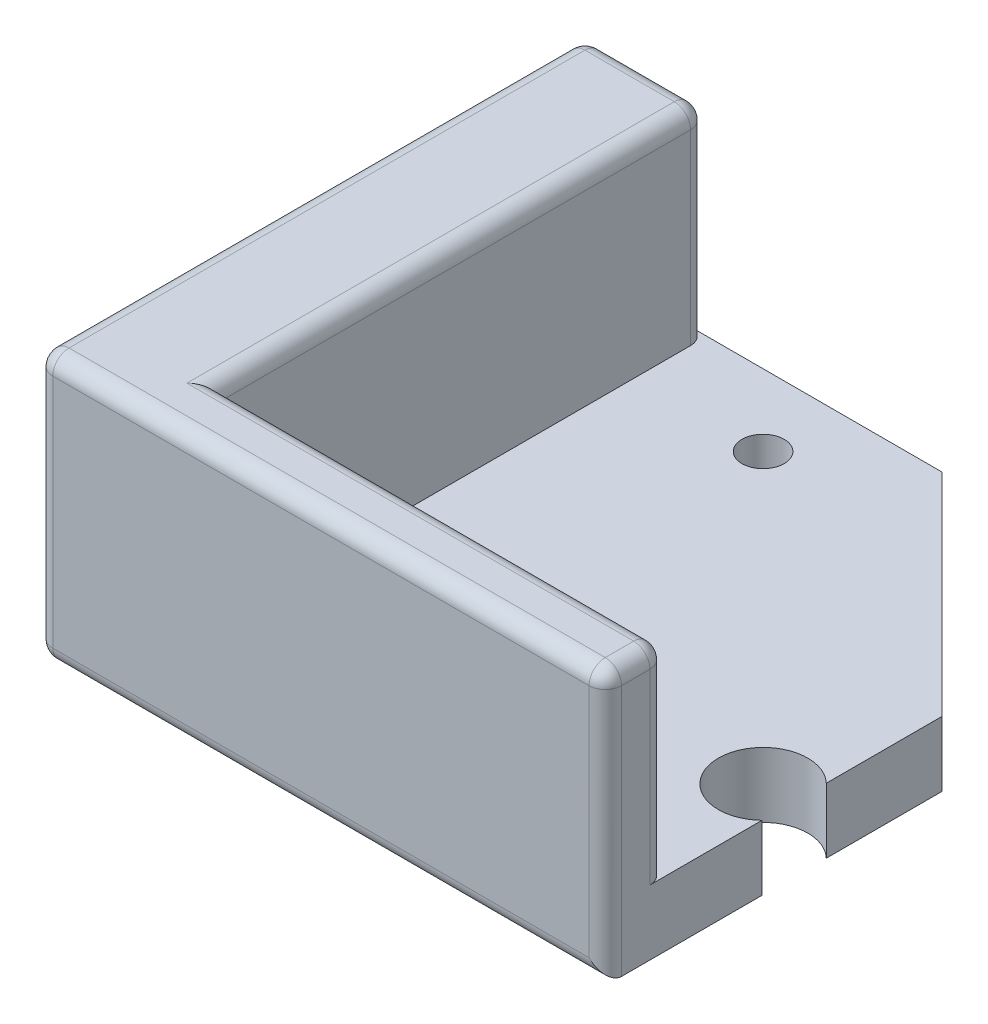
ISO-10303-21;
HEADER;
FILE_DESCRIPTION(('STEP AP214'),'2;1');
FILE_NAME('part.step','',(''),(''),'','','');
FILE_SCHEMA(('AUTOMOTIVE_DESIGN { 1 0 10303 214 1 1 1 1 }'));
ENDSEC;
DATA;
#1=APPLICATION_CONTEXT('core data for automotive mechanical design processes');
#2=APPLICATION_PROTOCOL_DEFINITION('international standard','automotive_design',2000,#1);
#3=PRODUCT_CONTEXT('',#1,'mechanical');
#4=PRODUCT('Part','Part','',(#3));
#5=PRODUCT_RELATED_PRODUCT_CATEGORY('part','',(#4));
#6=PRODUCT_DEFINITION_FORMATION('','',#4);
#7=PRODUCT_DEFINITION_CONTEXT('part definition',#1,'design');
#8=PRODUCT_DEFINITION('design','',#6,#7);
#9=PRODUCT_DEFINITION_SHAPE('','',#8);
#10=(LENGTH_UNIT() NAMED_UNIT(*) SI_UNIT(.MILLI.,.METRE.));
#11=(NAMED_UNIT(*) PLANE_ANGLE_UNIT() SI_UNIT($,.RADIAN.));
#12=(NAMED_UNIT(*) SI_UNIT($,.STERADIAN.) SOLID_ANGLE_UNIT());
#13=UNCERTAINTY_MEASURE_WITH_UNIT(LENGTH_MEASURE(1.E-05),#10,'distance_accuracy_value','');
#14=(GEOMETRIC_REPRESENTATION_CONTEXT(3) GLOBAL_UNCERTAINTY_ASSIGNED_CONTEXT((#13)) GLOBAL_UNIT_ASSIGNED_CONTEXT((#10,
#11,#12)) REPRESENTATION_CONTEXT('',''));
#15=CARTESIAN_POINT('',(0.,0.,0.));
#16=DIRECTION('',(0.,0.,1.));
#17=DIRECTION('',(1.,0.,0.));
#18=AXIS2_PLACEMENT_3D('',#15,#16,#17);
#19=CARTESIAN_POINT('',(0.,2.54,0.));
#20=DIRECTION('',(0.,1.,0.));
#21=DIRECTION('',(0.,0.,1.));
#22=AXIS2_PLACEMENT_3D('',#19,#20,#21);
#23=PLANE('',#22);
#24=DIRECTION('',(-1.,0.,0.));
#25=VECTOR('',#24,1.);
#26=CARTESIAN_POINT('',(34.925,2.54,3.4925));
#27=LINE('',#26,#25);
#28=CARTESIAN_POINT('',(-8.255,2.54,3.49250000000001));
#29=VERTEX_POINT('',#28);
#30=CARTESIAN_POINT('',(33.655,2.54,3.4925));
#31=VERTEX_POINT('',#30);
#32=EDGE_CURVE('E244',#29,#31,#27,.F.);
#33=ORIENTED_EDGE('',*,*,#32,.T.);
#34=DIRECTION('',(0.,0.,-1.));
#35=VECTOR('',#34,1.);
#36=CARTESIAN_POINT('',(33.655,2.54,0.));
#37=LINE('',#36,#35);
#38=CARTESIAN_POINT('',(33.655,2.54,1.27));
#39=VERTEX_POINT('',#38);
#40=EDGE_CURVE('E247',#31,#39,#37,.T.);
#41=ORIENTED_EDGE('',*,*,#40,.T.);
#42=DIRECTION('',(1.,0.,0.));
#43=VECTOR('',#42,1.);
#44=CARTESIAN_POINT('',(0.,2.54,1.27));
#45=LINE('',#44,#43);
#46=CARTESIAN_POINT('',(-1.27,2.54,1.27));
#47=VERTEX_POINT('',#46);
#48=EDGE_CURVE('E343',#39,#47,#45,.F.);
#49=ORIENTED_EDGE('',*,*,#48,.T.);
#50=DIRECTION('',(0.,0.,1.));
#51=VECTOR('',#50,1.);
#52=CARTESIAN_POINT('',(-1.27,2.54,-38.1));
#53=LINE('',#52,#51);
#54=CARTESIAN_POINT('',(-1.27,2.54,-36.83));
#55=VERTEX_POINT('',#54);
#56=EDGE_CURVE('E352',#47,#55,#53,.F.);
#57=ORIENTED_EDGE('',*,*,#56,.T.);
#58=DIRECTION('',(-1.,0.,0.));
#59=VECTOR('',#58,1.);
#60=CARTESIAN_POINT('',(-9.525,2.54,-36.83));
#61=LINE('',#60,#59);
#62=CARTESIAN_POINT('',(-8.255,2.54,-36.83));
#63=VERTEX_POINT('',#62);
#64=EDGE_CURVE('E336',#55,#63,#61,.T.);
#65=ORIENTED_EDGE('',*,*,#64,.T.);
#66=DIRECTION('',(0.,0.,1.));
#67=VECTOR('',#66,1.);
#68=CARTESIAN_POINT('',(-8.255,2.54,0.));
#69=LINE('',#68,#67);
#70=EDGE_CURVE('E332',#63,#29,#69,.T.);
#71=ORIENTED_EDGE('',*,*,#70,.T.);
#72=EDGE_LOOP('',(#33,#41,#49,#57,#65,#71));
#73=FACE_BOUND('',#72,.T.);
#74=ADVANCED_FACE('F47',(#73),#23,.T.);
#75=CARTESIAN_POINT('',(0.,-13.335,0.));
#76=DIRECTION('',(0.,0.,-1.));
#77=DIRECTION('',(-1.,0.,0.));
#78=AXIS2_PLACEMENT_3D('',#75,#76,#77);
#79=PLANE('',#78);
#80=DIRECTION('',(1.,0.,0.));
#81=VECTOR('',#80,1.);
#82=CARTESIAN_POINT('',(0.,1.27,0.));
#83=LINE('',#82,#81);
#84=CARTESIAN_POINT('',(0.,1.27,0.));
#85=VERTEX_POINT('',#84);
#86=CARTESIAN_POINT('',(33.655,1.27,0.));
#87=VERTEX_POINT('',#86);
#88=EDGE_CURVE('E371',#85,#87,#83,.T.);
#89=ORIENTED_EDGE('',*,*,#88,.T.);
#90=DIRECTION('',(0.,-1.,0.));
#91=VECTOR('',#90,1.);
#92=CARTESIAN_POINT('',(33.655,-13.335,0.));
#93=LINE('',#92,#91);
#94=CARTESIAN_POINT('',(33.655,-13.335,0.));
#95=VERTEX_POINT('',#94);
#96=EDGE_CURVE('E189',#87,#95,#93,.T.);
#97=ORIENTED_EDGE('',*,*,#96,.T.);
#98=DIRECTION('',(-1.,0.,0.));
#99=VECTOR('',#98,1.);
#100=CARTESIAN_POINT('',(0.,-13.335,0.));
#101=LINE('',#100,#99);
#102=CARTESIAN_POINT('',(0.,-13.335,0.));
#103=VERTEX_POINT('',#102);
#104=EDGE_CURVE('E446',#95,#103,#101,.T.);
#105=ORIENTED_EDGE('',*,*,#104,.T.);
#106=DIRECTION('',(0.,1.,0.));
#107=VECTOR('',#106,1.);
#108=CARTESIAN_POINT('',(0.,-13.335,0.));
#109=LINE('',#108,#107);
#110=EDGE_CURVE('E339',#103,#85,#109,.T.);
#111=ORIENTED_EDGE('',*,*,#110,.T.);
#112=EDGE_LOOP('',(#89,#97,#105,#111));
#113=FACE_BOUND('',#112,.T.);
#114=ADVANCED_FACE('F462',(#113),#79,.T.);
#115=CARTESIAN_POINT('',(0.,-13.335,0.));
#116=DIRECTION('',(0.,-1.,0.));
#117=DIRECTION('',(0.,0.,-1.));
#118=AXIS2_PLACEMENT_3D('',#115,#116,#117);
#119=PLANE('',#118);
#120=CARTESIAN_POINT('',(10.,-13.335,-32.5));
#121=DIRECTION('',(0.,-1.,0.));
#122=DIRECTION('',(0.,0.,-1.));
#123=AXIS2_PLACEMENT_3D('',#120,#121,#122);
#124=CIRCLE('',#123,1.65);
#125=CARTESIAN_POINT('',(10.,-13.335,-34.15));
#126=VERTEX_POINT('',#125);
#127=EDGE_CURVE('E421',#126,#126,#124,.T.);
#128=ORIENTED_EDGE('',*,*,#127,.T.);
#129=EDGE_LOOP('',(#128));
#130=FACE_BOUND('',#129,.T.);
#131=DIRECTION('',(0.,0.,1.));
#132=VECTOR('',#131,1.);
#133=CARTESIAN_POINT('',(34.925,-13.335,0.));
#134=LINE('',#133,#132);
#135=CARTESIAN_POINT('',(34.925,-13.335,-21.5480790919814));
#136=VERTEX_POINT('',#135);
#137=CARTESIAN_POINT('',(34.925,-13.335,-12.5133506022837));
#138=VERTEX_POINT('',#137);
#139=EDGE_CURVE('E183',#136,#138,#134,.T.);
#140=ORIENTED_EDGE('',*,*,#139,.F.);
#141=DIRECTION('',(0.707106781186549,0.,0.707106781186546));
#142=VECTOR('',#141,1.);
#143=CARTESIAN_POINT('',(38.1,-13.335,-18.3730790919814));
#144=LINE('',#143,#142);
#145=CARTESIAN_POINT('',(18.3730790919813,-13.335,-38.1));
#146=VERTEX_POINT('',#145);
#147=EDGE_CURVE('E434',#146,#136,#144,.T.);
#148=ORIENTED_EDGE('',*,*,#147,.F.);
#149=DIRECTION('',(1.,0.,0.));
#150=VECTOR('',#149,1.);
#151=CARTESIAN_POINT('',(-9.52499999999999,-13.335,-38.1));
#152=LINE('',#151,#150);
#153=CARTESIAN_POINT('',(-1.27,-13.335,-38.1));
#154=VERTEX_POINT('',#153);
#155=EDGE_CURVE('E427',#154,#146,#152,.T.);
#156=ORIENTED_EDGE('',*,*,#155,.F.);
#157=CARTESIAN_POINT('',(-1.27,-13.335,-36.83));
#158=DIRECTION('',(0.,-1.,0.));
#159=DIRECTION('',(0.,0.,-1.));
#160=AXIS2_PLACEMENT_3D('',#157,#158,#159);
#161=CIRCLE('',#160,1.27);
#162=CARTESIAN_POINT('',(0.,-13.335,-36.83));
#163=VERTEX_POINT('',#162);
#164=EDGE_CURVE('E221',#154,#163,#161,.T.);
#165=ORIENTED_EDGE('',*,*,#164,.T.);
#166=DIRECTION('',(0.,0.,1.));
#167=VECTOR('',#166,1.);
#168=CARTESIAN_POINT('',(0.,-13.335,0.));
#169=LINE('',#168,#167);
#170=EDGE_CURVE('E346',#163,#103,#169,.T.);
#171=ORIENTED_EDGE('',*,*,#170,.T.);
#172=ORIENTED_EDGE('',*,*,#104,.F.);
#173=CARTESIAN_POINT('',(33.655,-13.335,1.27));
#174=DIRECTION('',(0.,-1.,0.));
#175=DIRECTION('',(0.,0.,-1.));
#176=AXIS2_PLACEMENT_3D('',#173,#174,#175);
#177=CIRCLE('',#176,1.27);
#178=CARTESIAN_POINT('',(34.925,-13.335,1.27));
#179=VERTEX_POINT('',#178);
#180=EDGE_CURVE('E11',#95,#179,#177,.T.);
#181=ORIENTED_EDGE('',*,*,#180,.T.);
#182=CARTESIAN_POINT('',(34.925,-13.335,-7.48664939771626));
#183=VERTEX_POINT('',#182);
#184=EDGE_CURVE('E480',#183,#179,#134,.T.);
#185=ORIENTED_EDGE('',*,*,#184,.F.);
#186=CARTESIAN_POINT('',(32.5,-13.335,-10.));
#187=DIRECTION('',(0.,1.,0.));
#188=DIRECTION('',(0.,0.,1.));
#189=AXIS2_PLACEMENT_3D('',#186,#187,#188);
#190=CIRCLE('',#189,3.49250000000001);
#191=EDGE_CURVE('E207',#138,#183,#190,.T.);
#192=ORIENTED_EDGE('',*,*,#191,.F.);
#193=EDGE_LOOP('',(#140,#148,#156,#165,#171,#172,#181,#185,#192));
#194=FACE_BOUND('',#193,.T.);
#195=ADVANCED_FACE('F454',(#130,#194),#119,.F.);
#196=CARTESIAN_POINT('',(38.1,-18.415,-18.3730790919814));
#197=DIRECTION('',(-0.707106781186546,0.,0.707106781186549));
#198=DIRECTION('',(0.707106781186549,0.,0.707106781186546));
#199=AXIS2_PLACEMENT_3D('',#196,#197,#198);
#200=PLANE('',#199);
#201=DIRECTION('',(0.,1.,0.));
#202=VECTOR('',#201,1.);
#203=CARTESIAN_POINT('',(34.925,-18.415,-21.5480790919814));
#204=LINE('',#203,#202);
#205=CARTESIAN_POINT('',(34.925,-18.415,-21.5480790919814));
#206=VERTEX_POINT('',#205);
#207=EDGE_CURVE('E214',#206,#136,#204,.T.);
#208=ORIENTED_EDGE('',*,*,#207,.F.);
#209=DIRECTION('',(0.707106781186549,0.,0.707106781186546));
#210=VECTOR('',#209,1.);
#211=CARTESIAN_POINT('',(38.1,-18.415,-18.3730790919814));
#212=LINE('',#211,#210);
#213=CARTESIAN_POINT('',(18.3730790919813,-18.415,-38.1));
#214=VERTEX_POINT('',#213);
#215=EDGE_CURVE('E199',#214,#206,#212,.T.);
#216=ORIENTED_EDGE('',*,*,#215,.F.);
#217=DIRECTION('',(0.,1.,0.));
#218=VECTOR('',#217,1.);
#219=CARTESIAN_POINT('',(18.3730790919813,-18.415,-38.1));
#220=LINE('',#219,#218);
#221=EDGE_CURVE('E437',#214,#146,#220,.T.);
#222=ORIENTED_EDGE('',*,*,#221,.T.);
#223=ORIENTED_EDGE('',*,*,#147,.T.);
#224=EDGE_LOOP('',(#208,#216,#222,#223));
#225=FACE_BOUND('',#224,.T.);
#226=ADVANCED_FACE('F489',(#225),#200,.F.);
#227=CARTESIAN_POINT('',(0.,-18.415,0.));
#228=DIRECTION('',(0.,-1.,0.));
#229=DIRECTION('',(0.,0.,-1.));
#230=AXIS2_PLACEMENT_3D('',#227,#228,#229);
#231=PLANE('',#230);
#232=CARTESIAN_POINT('',(10.,-18.415,-32.5));
#233=DIRECTION('',(0.,-1.,0.));
#234=DIRECTION('',(0.,0.,-1.));
#235=AXIS2_PLACEMENT_3D('',#232,#233,#234);
#236=CIRCLE('',#235,1.65);
#237=CARTESIAN_POINT('',(10.,-18.415,-34.15));
#238=VERTEX_POINT('',#237);
#239=EDGE_CURVE('E414',#238,#238,#236,.T.);
#240=ORIENTED_EDGE('',*,*,#239,.F.);
#241=EDGE_LOOP('',(#240));
#242=FACE_BOUND('',#241,.T.);
#243=DIRECTION('',(0.,0.,-1.));
#244=VECTOR('',#243,1.);
#245=CARTESIAN_POINT('',(34.925,-18.415,0.));
#246=LINE('',#245,#244);
#247=CARTESIAN_POINT('',(34.925,-18.415,3.4925));
#248=VERTEX_POINT('',#247);
#249=CARTESIAN_POINT('',(34.925,-18.415,-7.48664939771626));
#250=VERTEX_POINT('',#249);
#251=EDGE_CURVE('E201',#248,#250,#246,.T.);
#252=ORIENTED_EDGE('',*,*,#251,.F.);
#253=DIRECTION('',(-1.,0.,0.));
#254=VECTOR('',#253,1.);
#255=CARTESIAN_POINT('',(-8.255,-18.415,3.49250000000001));
#256=LINE('',#255,#254);
#257=CARTESIAN_POINT('',(-8.255,-18.415,3.49250000000001));
#258=VERTEX_POINT('',#257);
#259=EDGE_CURVE('E260',#248,#258,#256,.T.);
#260=ORIENTED_EDGE('',*,*,#259,.T.);
#261=DIRECTION('',(0.,0.,-1.));
#262=VECTOR('',#261,1.);
#263=CARTESIAN_POINT('',(-8.255,-18.415,0.));
#264=LINE('',#263,#262);
#265=CARTESIAN_POINT('',(-8.255,-18.415,-38.1));
#266=VERTEX_POINT('',#265);
#267=EDGE_CURVE('E375',#258,#266,#264,.T.);
#268=ORIENTED_EDGE('',*,*,#267,.T.);
#269=DIRECTION('',(1.,0.,0.));
#270=VECTOR('',#269,1.);
#271=CARTESIAN_POINT('',(-9.52499999999999,-18.415,-38.1));
#272=LINE('',#271,#270);
#273=EDGE_CURVE('E431',#266,#214,#272,.T.);
#274=ORIENTED_EDGE('',*,*,#273,.T.);
#275=ORIENTED_EDGE('',*,*,#215,.T.);
#276=CARTESIAN_POINT('',(34.925,-18.415,-12.5133506022837));
#277=VERTEX_POINT('',#276);
#278=EDGE_CURVE('E180',#277,#206,#246,.T.);
#279=ORIENTED_EDGE('',*,*,#278,.F.);
#280=CARTESIAN_POINT('',(32.5,-18.415,-10.));
#281=DIRECTION('',(0.,-1.,0.));
#282=DIRECTION('',(0.,0.,-1.));
#283=AXIS2_PLACEMENT_3D('',#280,#281,#282);
#284=CIRCLE('',#283,3.49250000000001);
#285=EDGE_CURVE('E197',#250,#277,#284,.T.);
#286=ORIENTED_EDGE('',*,*,#285,.F.);
#287=EDGE_LOOP('',(#252,#260,#268,#274,#275,#279,#286));
#288=FACE_BOUND('',#287,.T.);
#289=ADVANCED_FACE('F196',(#242,#288),#231,.T.);
#290=CARTESIAN_POINT('',(0.,1.27,1.27));
#291=DIRECTION('',(1.,0.,0.));
#292=DIRECTION('',(0.,0.,-1.));
#293=AXIS2_PLACEMENT_3D('',#290,#291,#292);
#294=CYLINDRICAL_SURFACE('',#293,1.27);
#295=ORIENTED_EDGE('',*,*,#48,.F.);
#296=CARTESIAN_POINT('',(33.655,1.27,1.27));
#297=DIRECTION('',(1.,0.,0.));
#298=DIRECTION('',(0.,0.,-1.));
#299=AXIS2_PLACEMENT_3D('',#296,#297,#298);
#300=CIRCLE('',#299,1.27);
#301=EDGE_CURVE('E235',#39,#87,#300,.F.);
#302=ORIENTED_EDGE('',*,*,#301,.T.);
#303=ORIENTED_EDGE('',*,*,#88,.F.);
#304=CARTESIAN_POINT('',(-1.27,1.27,1.27));
#305=DIRECTION('',(-0.707106781186547,0.,-0.707106781186547));
#306=DIRECTION('',(0.707106781186547,0.,-0.707106781186547));
#307=AXIS2_PLACEMENT_3D('',#304,#305,#306);
#308=ELLIPSE('',#307,1.79605122421383,1.27);
#309=EDGE_CURVE('E206',#85,#47,#308,.F.);
#310=ORIENTED_EDGE('',*,*,#309,.T.);
#311=EDGE_LOOP('',(#295,#302,#303,#310));
#312=FACE_BOUND('',#311,.T.);
#313=ADVANCED_FACE('F470',(#312),#294,.T.);
#314=CARTESIAN_POINT('',(32.5,-23.495,-10.));
#315=DIRECTION('',(0.,1.,0.));
#316=DIRECTION('',(0.,0.,1.));
#317=AXIS2_PLACEMENT_3D('',#314,#315,#316);
#318=CYLINDRICAL_SURFACE('',#317,3.49250000000001);
#319=DIRECTION('',(0.,1.,0.));
#320=VECTOR('',#319,1.);
#321=CARTESIAN_POINT('',(34.925,-23.495,-12.5133506022837));
#322=LINE('',#321,#320);
#323=EDGE_CURVE('E177',#138,#277,#322,.F.);
#324=ORIENTED_EDGE('',*,*,#323,.F.);
#325=ORIENTED_EDGE('',*,*,#191,.T.);
#326=DIRECTION('',(0.,1.,0.));
#327=VECTOR('',#326,1.);
#328=CARTESIAN_POINT('',(34.925,-23.495,-7.48664939771626));
#329=LINE('',#328,#327);
#330=EDGE_CURVE('E190',#250,#183,#329,.T.);
#331=ORIENTED_EDGE('',*,*,#330,.F.);
#332=ORIENTED_EDGE('',*,*,#285,.T.);
#333=EDGE_LOOP('',(#324,#325,#331,#332));
#334=FACE_BOUND('',#333,.T.);
#335=ADVANCED_FACE('F204',(#334),#318,.F.);
#336=CARTESIAN_POINT('',(2.38125,2.54,-38.1));
#337=DIRECTION('',(0.,0.,1.));
#338=DIRECTION('',(1.,0.,0.));
#339=AXIS2_PLACEMENT_3D('',#336,#337,#338);
#340=PLANE('',#339);
#341=ORIENTED_EDGE('',*,*,#273,.F.);
#342=DIRECTION('',(0.,1.,0.));
#343=VECTOR('',#342,1.);
#344=CARTESIAN_POINT('',(-8.255,2.54,-38.1));
#345=LINE('',#344,#343);
#346=CARTESIAN_POINT('',(-8.255,1.27,-38.1));
#347=VERTEX_POINT('',#346);
#348=EDGE_CURVE('E362',#266,#347,#345,.T.);
#349=ORIENTED_EDGE('',*,*,#348,.T.);
#350=DIRECTION('',(-1.,0.,0.));
#351=VECTOR('',#350,1.);
#352=CARTESIAN_POINT('',(0.,1.27,-38.1));
#353=LINE('',#352,#351);
#354=CARTESIAN_POINT('',(-1.27,1.27,-38.1));
#355=VERTEX_POINT('',#354);
#356=EDGE_CURVE('E359',#347,#355,#353,.F.);
#357=ORIENTED_EDGE('',*,*,#356,.T.);
#358=DIRECTION('',(0.,1.,0.));
#359=VECTOR('',#358,1.);
#360=CARTESIAN_POINT('',(-1.27,2.54,-38.1));
#361=LINE('',#360,#359);
#362=EDGE_CURVE('E355',#355,#154,#361,.F.);
#363=ORIENTED_EDGE('',*,*,#362,.T.);
#364=ORIENTED_EDGE('',*,*,#155,.T.);
#365=ORIENTED_EDGE('',*,*,#221,.F.);
#366=EDGE_LOOP('',(#341,#349,#357,#363,#364,#365));
#367=FACE_BOUND('',#366,.T.);
#368=ADVANCED_FACE('F493',(#367),#340,.F.);
#369=CARTESIAN_POINT('',(0.,-13.335,0.));
#370=DIRECTION('',(-1.,0.,0.));
#371=DIRECTION('',(0.,0.,1.));
#372=AXIS2_PLACEMENT_3D('',#369,#370,#371);
#373=PLANE('',#372);
#374=DIRECTION('',(0.,1.,0.));
#375=VECTOR('',#374,1.);
#376=CARTESIAN_POINT('',(0.,-13.335,-36.83));
#377=LINE('',#376,#375);
#378=CARTESIAN_POINT('',(0.,1.27,-36.83));
#379=VERTEX_POINT('',#378);
#380=EDGE_CURVE('E365',#163,#379,#377,.T.);
#381=ORIENTED_EDGE('',*,*,#380,.T.);
#382=DIRECTION('',(0.,0.,1.));
#383=VECTOR('',#382,1.);
#384=CARTESIAN_POINT('',(0.,1.27,0.));
#385=LINE('',#384,#383);
#386=EDGE_CURVE('E368',#379,#85,#385,.T.);
#387=ORIENTED_EDGE('',*,*,#386,.T.);
#388=ORIENTED_EDGE('',*,*,#110,.F.);
#389=ORIENTED_EDGE('',*,*,#170,.F.);
#390=EDGE_LOOP('',(#381,#387,#388,#389));
#391=FACE_BOUND('',#390,.T.);
#392=ADVANCED_FACE('F458',(#391),#373,.F.);
#393=CARTESIAN_POINT('',(-9.525,-13.335,0.));
#394=DIRECTION('',(-1.,0.,0.));
#395=DIRECTION('',(0.,0.,1.));
#396=AXIS2_PLACEMENT_3D('',#393,#394,#395);
#397=PLANE('',#396);
#398=DIRECTION('',(0.,0.,-1.));
#399=VECTOR('',#398,1.);
#400=CARTESIAN_POINT('',(-9.525,-17.145,0.));
#401=LINE('',#400,#399);
#402=CARTESIAN_POINT('',(-9.525,-17.145,-36.83));
#403=VERTEX_POINT('',#402);
#404=CARTESIAN_POINT('',(-9.525,-17.145,3.49250000000001));
#405=VERTEX_POINT('',#404);
#406=EDGE_CURVE('E383',#403,#405,#401,.F.);
#407=ORIENTED_EDGE('',*,*,#406,.T.);
#408=DIRECTION('',(0.,-1.,0.));
#409=VECTOR('',#408,1.);
#410=CARTESIAN_POINT('',(-9.525,1.27,3.49250000000001));
#411=LINE('',#410,#409);
#412=CARTESIAN_POINT('',(-9.525,1.27,3.49250000000001));
#413=VERTEX_POINT('',#412);
#414=EDGE_CURVE('E57',#405,#413,#411,.F.);
#415=ORIENTED_EDGE('',*,*,#414,.T.);
#416=DIRECTION('',(0.,0.,1.));
#417=VECTOR('',#416,1.);
#418=CARTESIAN_POINT('',(-9.525,1.27,0.));
#419=LINE('',#418,#417);
#420=CARTESIAN_POINT('',(-9.525,1.27,-36.83));
#421=VERTEX_POINT('',#420);
#422=EDGE_CURVE('E333',#413,#421,#419,.F.);
#423=ORIENTED_EDGE('',*,*,#422,.T.);
#424=DIRECTION('',(0.,1.,0.));
#425=VECTOR('',#424,1.);
#426=CARTESIAN_POINT('',(-9.525,-18.415,-36.83));
#427=LINE('',#426,#425);
#428=EDGE_CURVE('E380',#421,#403,#427,.F.);
#429=ORIENTED_EDGE('',*,*,#428,.T.);
#430=EDGE_LOOP('',(#407,#415,#423,#429));
#431=FACE_BOUND('',#430,.T.);
#432=ADVANCED_FACE('F525',(#431),#397,.T.);
#433=CARTESIAN_POINT('',(10.,-18.415,-32.5));
#434=DIRECTION('',(0.,-1.,0.));
#435=DIRECTION('',(0.,0.,-1.));
#436=AXIS2_PLACEMENT_3D('',#433,#434,#435);
#437=CYLINDRICAL_SURFACE('',#436,1.65);
#438=ORIENTED_EDGE('',*,*,#239,.T.);
#439=EDGE_LOOP('',(#438));
#440=FACE_BOUND('',#439,.T.);
#441=ORIENTED_EDGE('',*,*,#127,.F.);
#442=EDGE_LOOP('',(#441));
#443=FACE_BOUND('',#442,.T.);
#444=ADVANCED_FACE('F795',(#440,#443),#437,.F.);
#445=CARTESIAN_POINT('',(-8.255,2.54,-36.83));
#446=DIRECTION('',(0.,-1.,0.));
#447=DIRECTION('',(0.,0.,-1.));
#448=AXIS2_PLACEMENT_3D('',#445,#446,#447);
#449=CYLINDRICAL_SURFACE('',#448,1.27);
#450=CARTESIAN_POINT('',(-8.255,1.27,-36.83));
#451=DIRECTION('',(0.,1.,0.));
#452=DIRECTION('',(0.,0.,1.));
#453=AXIS2_PLACEMENT_3D('',#450,#451,#452);
#454=CIRCLE('',#453,1.27);
#455=EDGE_CURVE('E405',#347,#421,#454,.T.);
#456=ORIENTED_EDGE('',*,*,#455,.F.);
#457=ORIENTED_EDGE('',*,*,#348,.F.);
#458=CARTESIAN_POINT('',(-8.255,-17.145,-36.83));
#459=DIRECTION('',(0.,-0.707106781186547,0.707106781186547));
#460=DIRECTION('',(0.,-0.707106781186547,-0.707106781186547));
#461=AXIS2_PLACEMENT_3D('',#458,#459,#460);
#462=ELLIPSE('',#461,1.79605122421383,1.27);
#463=EDGE_CURVE('E218',#403,#266,#462,.T.);
#464=ORIENTED_EDGE('',*,*,#463,.F.);
#465=ORIENTED_EDGE('',*,*,#428,.F.);
#466=EDGE_LOOP('',(#456,#457,#464,#465));
#467=FACE_BOUND('',#466,.T.);
#468=ADVANCED_FACE('F515',(#467),#449,.T.);
#469=CARTESIAN_POINT('',(-8.255,-17.145,0.));
#470=DIRECTION('',(0.,0.,-1.));
#471=DIRECTION('',(-1.,0.,0.));
#472=AXIS2_PLACEMENT_3D('',#469,#470,#471);
#473=CYLINDRICAL_SURFACE('',#472,1.27);
#474=ORIENTED_EDGE('',*,*,#267,.F.);
#475=CARTESIAN_POINT('',(-8.255,-17.145,3.49250000000001));
#476=DIRECTION('',(0.,0.,-1.));
#477=DIRECTION('',(-1.,0.,0.));
#478=AXIS2_PLACEMENT_3D('',#475,#476,#477);
#479=CIRCLE('',#478,1.27);
#480=EDGE_CURVE('E238',#258,#405,#479,.T.);
#481=ORIENTED_EDGE('',*,*,#480,.T.);
#482=ORIENTED_EDGE('',*,*,#406,.F.);
#483=ORIENTED_EDGE('',*,*,#463,.T.);
#484=EDGE_LOOP('',(#474,#481,#482,#483));
#485=FACE_BOUND('',#484,.T.);
#486=ADVANCED_FACE('F508',(#485),#473,.T.);
#487=CARTESIAN_POINT('',(-8.255,1.27,-36.83));
#488=DIRECTION('',(0.,0.,-1.));
#489=DIRECTION('',(-1.,0.,0.));
#490=AXIS2_PLACEMENT_3D('',#487,#488,#489);
#491=SPHERICAL_SURFACE('',#490,1.27);
#492=CARTESIAN_POINT('',(-8.255,1.27,-36.83));
#493=DIRECTION('',(0.,0.,-1.));
#494=DIRECTION('',(-1.,0.,0.));
#495=AXIS2_PLACEMENT_3D('',#492,#493,#494);
#496=CIRCLE('',#495,1.27);
#497=EDGE_CURVE('E400',#63,#421,#496,.F.);
#498=ORIENTED_EDGE('',*,*,#497,.F.);
#499=CARTESIAN_POINT('',(-8.255,1.27,-36.83));
#500=DIRECTION('',(-1.,0.,0.));
#501=DIRECTION('',(0.,0.,1.));
#502=AXIS2_PLACEMENT_3D('',#499,#500,#501);
#503=CIRCLE('',#502,1.27);
#504=EDGE_CURVE('E403',#347,#63,#503,.F.);
#505=ORIENTED_EDGE('',*,*,#504,.F.);
#506=ORIENTED_EDGE('',*,*,#455,.T.);
#507=EDGE_LOOP('',(#498,#505,#506));
#508=FACE_BOUND('',#507,.T.);
#509=ADVANCED_FACE('F506',(#508),#491,.T.);
#510=CARTESIAN_POINT('',(0.,1.27,-36.83));
#511=DIRECTION('',(1.,0.,0.));
#512=DIRECTION('',(0.,0.,-1.));
#513=AXIS2_PLACEMENT_3D('',#510,#511,#512);
#514=CYLINDRICAL_SURFACE('',#513,1.27);
#515=ORIENTED_EDGE('',*,*,#504,.T.);
#516=ORIENTED_EDGE('',*,*,#64,.F.);
#517=CARTESIAN_POINT('',(-1.27,1.27,-36.83));
#518=DIRECTION('',(1.,0.,0.));
#519=DIRECTION('',(0.,0.,-1.));
#520=AXIS2_PLACEMENT_3D('',#517,#518,#519);
#521=CIRCLE('',#520,1.27);
#522=EDGE_CURVE('E396',#355,#55,#521,.T.);
#523=ORIENTED_EDGE('',*,*,#522,.F.);
#524=ORIENTED_EDGE('',*,*,#356,.F.);
#525=EDGE_LOOP('',(#515,#516,#523,#524));
#526=FACE_BOUND('',#525,.T.);
#527=ADVANCED_FACE('F505',(#526),#514,.T.);
#528=CARTESIAN_POINT('',(-1.27,-13.335,-36.83));
#529=DIRECTION('',(0.,1.,0.));
#530=DIRECTION('',(0.,0.,1.));
#531=AXIS2_PLACEMENT_3D('',#528,#529,#530);
#532=CYLINDRICAL_SURFACE('',#531,1.27);
#533=ORIENTED_EDGE('',*,*,#164,.F.);
#534=ORIENTED_EDGE('',*,*,#362,.F.);
#535=CARTESIAN_POINT('',(-1.27,1.27,-36.83));
#536=DIRECTION('',(0.,1.,0.));
#537=DIRECTION('',(0.,0.,1.));
#538=AXIS2_PLACEMENT_3D('',#535,#536,#537);
#539=CIRCLE('',#538,1.27);
#540=EDGE_CURVE('E392',#379,#355,#539,.T.);
#541=ORIENTED_EDGE('',*,*,#540,.F.);
#542=ORIENTED_EDGE('',*,*,#380,.F.);
#543=EDGE_LOOP('',(#533,#534,#541,#542));
#544=FACE_BOUND('',#543,.T.);
#545=ADVANCED_FACE('F500',(#544),#532,.T.);
#546=CARTESIAN_POINT('',(-8.255,1.27,0.));
#547=DIRECTION('',(0.,0.,1.));
#548=DIRECTION('',(1.,0.,0.));
#549=AXIS2_PLACEMENT_3D('',#546,#547,#548);
#550=CYLINDRICAL_SURFACE('',#549,1.27);
#551=ORIENTED_EDGE('',*,*,#422,.F.);
#552=CARTESIAN_POINT('',(-8.255,1.27,3.49250000000001));
#553=DIRECTION('',(0.,0.,1.));
#554=DIRECTION('',(1.,0.,0.));
#555=AXIS2_PLACEMENT_3D('',#552,#553,#554);
#556=CIRCLE('',#555,1.27);
#557=EDGE_CURVE('E241',#413,#29,#556,.F.);
#558=ORIENTED_EDGE('',*,*,#557,.T.);
#559=ORIENTED_EDGE('',*,*,#70,.F.);
#560=ORIENTED_EDGE('',*,*,#497,.T.);
#561=EDGE_LOOP('',(#551,#558,#559,#560));
#562=FACE_BOUND('',#561,.T.);
#563=ADVANCED_FACE('F330',(#562),#550,.T.);
#564=CARTESIAN_POINT('',(-1.27,1.27,-36.83));
#565=DIRECTION('',(0.,0.,-1.));
#566=DIRECTION('',(-1.,0.,0.));
#567=AXIS2_PLACEMENT_3D('',#564,#565,#566);
#568=SPHERICAL_SURFACE('',#567,1.27);
#569=ORIENTED_EDGE('',*,*,#540,.T.);
#570=ORIENTED_EDGE('',*,*,#522,.T.);
#571=CARTESIAN_POINT('',(-1.27,1.27,-36.83));
#572=DIRECTION('',(0.,0.,-1.));
#573=DIRECTION('',(-1.,0.,0.));
#574=AXIS2_PLACEMENT_3D('',#571,#572,#573);
#575=CIRCLE('',#574,1.27);
#576=EDGE_CURVE('E212',#379,#55,#575,.F.);
#577=ORIENTED_EDGE('',*,*,#576,.F.);
#578=EDGE_LOOP('',(#569,#570,#577));
#579=FACE_BOUND('',#578,.T.);
#580=ADVANCED_FACE('F503',(#579),#568,.T.);
#581=CARTESIAN_POINT('',(-1.27,1.27,0.));
#582=DIRECTION('',(0.,0.,-1.));
#583=DIRECTION('',(-1.,0.,0.));
#584=AXIS2_PLACEMENT_3D('',#581,#582,#583);
#585=CYLINDRICAL_SURFACE('',#584,1.27);
#586=ORIENTED_EDGE('',*,*,#576,.T.);
#587=ORIENTED_EDGE('',*,*,#56,.F.);
#588=ORIENTED_EDGE('',*,*,#309,.F.);
#589=ORIENTED_EDGE('',*,*,#386,.F.);
#590=EDGE_LOOP('',(#586,#587,#588,#589));
#591=FACE_BOUND('',#590,.T.);
#592=ADVANCED_FACE('F467',(#591),#585,.T.);
#593=CARTESIAN_POINT('',(34.925,-18.415,0.));
#594=DIRECTION('',(1.,0.,0.));
#595=DIRECTION('',(0.,0.,-1.));
#596=AXIS2_PLACEMENT_3D('',#593,#594,#595);
#597=PLANE('',#596);
#598=ORIENTED_EDGE('',*,*,#184,.T.);
#599=DIRECTION('',(0.,-1.,0.));
#600=VECTOR('',#599,1.);
#601=CARTESIAN_POINT('',(34.925,-18.415,1.27));
#602=LINE('',#601,#600);
#603=CARTESIAN_POINT('',(34.925,1.27,1.27));
#604=VERTEX_POINT('',#603);
#605=EDGE_CURVE('E232',#179,#604,#602,.F.);
#606=ORIENTED_EDGE('',*,*,#605,.T.);
#607=DIRECTION('',(0.,0.,-1.));
#608=VECTOR('',#607,1.);
#609=CARTESIAN_POINT('',(34.925,1.27,0.));
#610=LINE('',#609,#608);
#611=CARTESIAN_POINT('',(34.925,1.27,3.4925));
#612=VERTEX_POINT('',#611);
#613=EDGE_CURVE('E229',#604,#612,#610,.F.);
#614=ORIENTED_EDGE('',*,*,#613,.T.);
#615=DIRECTION('',(0.,1.,0.));
#616=VECTOR('',#615,1.);
#617=CARTESIAN_POINT('',(34.925,-18.415,3.4925));
#618=LINE('',#617,#616);
#619=EDGE_CURVE('E226',#612,#248,#618,.F.);
#620=ORIENTED_EDGE('',*,*,#619,.T.);
#621=ORIENTED_EDGE('',*,*,#251,.T.);
#622=ORIENTED_EDGE('',*,*,#330,.T.);
#623=EDGE_LOOP('',(#598,#606,#614,#620,#621,#622));
#624=FACE_BOUND('',#623,.T.);
#625=ADVANCED_FACE('F532',(#624),#597,.T.);
#626=CARTESIAN_POINT('',(0.,-18.415,4.7625));
#627=DIRECTION('',(0.,0.,-1.));
#628=DIRECTION('',(-1.,0.,0.));
#629=AXIS2_PLACEMENT_3D('',#626,#627,#628);
#630=PLANE('',#629);
#631=DIRECTION('',(-1.,0.,0.));
#632=VECTOR('',#631,1.);
#633=CARTESIAN_POINT('',(34.925,-17.145,4.7625));
#634=LINE('',#633,#632);
#635=CARTESIAN_POINT('',(-8.255,-17.145,4.76250000000001));
#636=VERTEX_POINT('',#635);
#637=CARTESIAN_POINT('',(33.655,-17.145,4.7625));
#638=VERTEX_POINT('',#637);
#639=EDGE_CURVE('E65',#636,#638,#634,.F.);
#640=ORIENTED_EDGE('',*,*,#639,.T.);
#641=DIRECTION('',(0.,1.,0.));
#642=VECTOR('',#641,1.);
#643=CARTESIAN_POINT('',(33.655,2.54,4.7625));
#644=LINE('',#643,#642);
#645=CARTESIAN_POINT('',(33.655,1.27,4.7625));
#646=VERTEX_POINT('',#645);
#647=EDGE_CURVE('E257',#638,#646,#644,.T.);
#648=ORIENTED_EDGE('',*,*,#647,.T.);
#649=DIRECTION('',(-1.,0.,0.));
#650=VECTOR('',#649,1.);
#651=CARTESIAN_POINT('',(-8.255,1.27,4.76250000000001));
#652=LINE('',#651,#650);
#653=CARTESIAN_POINT('',(-8.255,1.27,4.76250000000001));
#654=VERTEX_POINT('',#653);
#655=EDGE_CURVE('E250',#646,#654,#652,.T.);
#656=ORIENTED_EDGE('',*,*,#655,.T.);
#657=DIRECTION('',(0.,-1.,0.));
#658=VECTOR('',#657,1.);
#659=CARTESIAN_POINT('',(-8.255,-17.145,4.76250000000001));
#660=LINE('',#659,#658);
#661=EDGE_CURVE('E70',#654,#636,#660,.T.);
#662=ORIENTED_EDGE('',*,*,#661,.T.);
#663=EDGE_LOOP('',(#640,#648,#656,#662));
#664=FACE_BOUND('',#663,.T.);
#665=ADVANCED_FACE('F316',(#664),#630,.F.);
#666=ORIENTED_EDGE('',*,*,#207,.T.);
#667=ORIENTED_EDGE('',*,*,#139,.T.);
#668=ORIENTED_EDGE('',*,*,#323,.T.);
#669=ORIENTED_EDGE('',*,*,#278,.T.);
#670=EDGE_LOOP('',(#666,#667,#668,#669));
#671=FACE_BOUND('',#670,.T.);
#672=ADVANCED_FACE('F179',(#671),#597,.T.);
#673=CARTESIAN_POINT('',(-8.255,-17.145,3.49250000000001));
#674=DIRECTION('',(0.,0.,-1.));
#675=DIRECTION('',(-1.,0.,0.));
#676=AXIS2_PLACEMENT_3D('',#673,#674,#675);
#677=SPHERICAL_SURFACE('',#676,1.27);
#678=CARTESIAN_POINT('',(-8.255,-17.145,3.49250000000001));
#679=DIRECTION('',(1.,0.,0.));
#680=DIRECTION('',(0.,0.,-1.));
#681=AXIS2_PLACEMENT_3D('',#678,#679,#680);
#682=CIRCLE('',#681,1.27);
#683=EDGE_CURVE('E295',#636,#258,#682,.T.);
#684=ORIENTED_EDGE('',*,*,#683,.F.);
#685=CARTESIAN_POINT('',(-8.255,-17.145,3.49250000000001));
#686=DIRECTION('',(0.,1.,0.));
#687=DIRECTION('',(0.,0.,1.));
#688=AXIS2_PLACEMENT_3D('',#685,#686,#687);
#689=CIRCLE('',#688,1.27);
#690=EDGE_CURVE('E51',#405,#636,#689,.T.);
#691=ORIENTED_EDGE('',*,*,#690,.F.);
#692=ORIENTED_EDGE('',*,*,#480,.F.);
#693=EDGE_LOOP('',(#684,#691,#692));
#694=FACE_BOUND('',#693,.T.);
#695=ADVANCED_FACE('F49',(#694),#677,.T.);
#696=CARTESIAN_POINT('',(-8.255,-18.415,3.49250000000001));
#697=DIRECTION('',(0.,1.,0.));
#698=DIRECTION('',(0.,0.,1.));
#699=AXIS2_PLACEMENT_3D('',#696,#697,#698);
#700=CYLINDRICAL_SURFACE('',#699,1.27);
#701=ORIENTED_EDGE('',*,*,#690,.T.);
#702=ORIENTED_EDGE('',*,*,#661,.F.);
#703=CARTESIAN_POINT('',(-8.255,1.27,3.49250000000001));
#704=DIRECTION('',(0.,1.,0.));
#705=DIRECTION('',(0.,0.,1.));
#706=AXIS2_PLACEMENT_3D('',#703,#704,#705);
#707=CIRCLE('',#706,1.27);
#708=EDGE_CURVE('E292',#413,#654,#707,.T.);
#709=ORIENTED_EDGE('',*,*,#708,.F.);
#710=ORIENTED_EDGE('',*,*,#414,.F.);
#711=EDGE_LOOP('',(#701,#702,#709,#710));
#712=FACE_BOUND('',#711,.T.);
#713=ADVANCED_FACE('F305',(#712),#700,.T.);
#714=CARTESIAN_POINT('',(0.,-17.145,3.4925));
#715=DIRECTION('',(1.,0.,0.));
#716=DIRECTION('',(0.,0.,-1.));
#717=AXIS2_PLACEMENT_3D('',#714,#715,#716);
#718=CYLINDRICAL_SURFACE('',#717,1.27);
#719=ORIENTED_EDGE('',*,*,#683,.T.);
#720=ORIENTED_EDGE('',*,*,#259,.F.);
#721=CARTESIAN_POINT('',(33.655,-17.145,3.4925));
#722=DIRECTION('',(0.707106781186547,0.707106781186547,0.));
#723=DIRECTION('',(0.707106781186547,-0.707106781186547,0.));
#724=AXIS2_PLACEMENT_3D('',#721,#722,#723);
#725=ELLIPSE('',#724,1.79605122421383,1.27);
#726=EDGE_CURVE('E288',#638,#248,#725,.T.);
#727=ORIENTED_EDGE('',*,*,#726,.F.);
#728=ORIENTED_EDGE('',*,*,#639,.F.);
#729=EDGE_LOOP('',(#719,#720,#727,#728));
#730=FACE_BOUND('',#729,.T.);
#731=ADVANCED_FACE('F309',(#730),#718,.T.);
#732=CARTESIAN_POINT('',(-8.255,1.27,3.49250000000001));
#733=DIRECTION('',(0.,0.,-1.));
#734=DIRECTION('',(-1.,0.,0.));
#735=AXIS2_PLACEMENT_3D('',#732,#733,#734);
#736=SPHERICAL_SURFACE('',#735,1.27);
#737=ORIENTED_EDGE('',*,*,#557,.F.);
#738=ORIENTED_EDGE('',*,*,#708,.T.);
#739=CARTESIAN_POINT('',(-8.255,1.27,3.49250000000001));
#740=DIRECTION('',(1.,0.,0.));
#741=DIRECTION('',(0.,0.,-1.));
#742=AXIS2_PLACEMENT_3D('',#739,#740,#741);
#743=CIRCLE('',#742,1.27);
#744=EDGE_CURVE('E284',#29,#654,#743,.T.);
#745=ORIENTED_EDGE('',*,*,#744,.F.);
#746=EDGE_LOOP('',(#737,#738,#745));
#747=FACE_BOUND('',#746,.T.);
#748=ADVANCED_FACE('F325',(#747),#736,.T.);
#749=CARTESIAN_POINT('',(33.655,-18.415,3.4925));
#750=DIRECTION('',(0.,-1.,0.));
#751=DIRECTION('',(0.,0.,-1.));
#752=AXIS2_PLACEMENT_3D('',#749,#750,#751);
#753=CYLINDRICAL_SURFACE('',#752,1.27);
#754=ORIENTED_EDGE('',*,*,#726,.T.);
#755=ORIENTED_EDGE('',*,*,#619,.F.);
#756=CARTESIAN_POINT('',(33.655,1.27,3.4925));
#757=DIRECTION('',(0.,1.,0.));
#758=DIRECTION('',(-1.,0.,0.));
#759=AXIS2_PLACEMENT_3D('',#756,#757,#758);
#760=CIRCLE('',#759,1.27);
#761=EDGE_CURVE('E280',#646,#612,#760,.T.);
#762=ORIENTED_EDGE('',*,*,#761,.F.);
#763=ORIENTED_EDGE('',*,*,#647,.F.);
#764=EDGE_LOOP('',(#754,#755,#762,#763));
#765=FACE_BOUND('',#764,.T.);
#766=ADVANCED_FACE('F314',(#765),#753,.T.);
#767=CARTESIAN_POINT('',(0.,1.27,3.4925));
#768=DIRECTION('',(1.,0.,0.));
#769=DIRECTION('',(0.,0.,-1.));
#770=AXIS2_PLACEMENT_3D('',#767,#768,#769);
#771=CYLINDRICAL_SURFACE('',#770,1.27);
#772=ORIENTED_EDGE('',*,*,#744,.T.);
#773=ORIENTED_EDGE('',*,*,#655,.F.);
#774=CARTESIAN_POINT('',(33.655,1.27,3.4925));
#775=DIRECTION('',(1.,0.,0.));
#776=DIRECTION('',(0.,0.,-1.));
#777=AXIS2_PLACEMENT_3D('',#774,#775,#776);
#778=CIRCLE('',#777,1.27);
#779=EDGE_CURVE('E277',#31,#646,#778,.T.);
#780=ORIENTED_EDGE('',*,*,#779,.F.);
#781=ORIENTED_EDGE('',*,*,#32,.F.);
#782=EDGE_LOOP('',(#772,#773,#780,#781));
#783=FACE_BOUND('',#782,.T.);
#784=ADVANCED_FACE('F319',(#783),#771,.T.);
#785=CARTESIAN_POINT('',(33.655,1.27,3.4925));
#786=DIRECTION('',(0.,0.,1.));
#787=DIRECTION('',(0.,-1.,0.));
#788=AXIS2_PLACEMENT_3D('',#785,#786,#787);
#789=SPHERICAL_SURFACE('',#788,1.27);
#790=ORIENTED_EDGE('',*,*,#779,.T.);
#791=ORIENTED_EDGE('',*,*,#761,.T.);
#792=CARTESIAN_POINT('',(33.655,1.27,3.4925));
#793=DIRECTION('',(0.,0.,1.));
#794=DIRECTION('',(0.,-1.,0.));
#795=AXIS2_PLACEMENT_3D('',#792,#793,#794);
#796=CIRCLE('',#795,1.27);
#797=EDGE_CURVE('E273',#31,#612,#796,.F.);
#798=ORIENTED_EDGE('',*,*,#797,.F.);
#799=EDGE_LOOP('',(#790,#791,#798));
#800=FACE_BOUND('',#799,.T.);
#801=ADVANCED_FACE('F608',(#800),#789,.T.);
#802=CARTESIAN_POINT('',(33.655,1.27,0.));
#803=DIRECTION('',(0.,0.,-1.));
#804=DIRECTION('',(-1.,0.,0.));
#805=AXIS2_PLACEMENT_3D('',#802,#803,#804);
#806=CYLINDRICAL_SURFACE('',#805,1.27);
#807=CARTESIAN_POINT('',(33.655,1.27,1.27));
#808=DIRECTION('',(0.,0.,-1.));
#809=DIRECTION('',(-1.,0.,0.));
#810=AXIS2_PLACEMENT_3D('',#807,#808,#809);
#811=CIRCLE('',#810,1.27);
#812=EDGE_CURVE('E269',#39,#604,#811,.T.);
#813=ORIENTED_EDGE('',*,*,#812,.F.);
#814=ORIENTED_EDGE('',*,*,#40,.F.);
#815=ORIENTED_EDGE('',*,*,#797,.T.);
#816=ORIENTED_EDGE('',*,*,#613,.F.);
#817=EDGE_LOOP('',(#813,#814,#815,#816));
#818=FACE_BOUND('',#817,.T.);
#819=ADVANCED_FACE('F615',(#818),#806,.T.);
#820=CARTESIAN_POINT('',(33.655,1.27,1.27));
#821=DIRECTION('',(1.,0.,0.));
#822=DIRECTION('',(0.,0.,-1.));
#823=AXIS2_PLACEMENT_3D('',#820,#821,#822);
#824=SPHERICAL_SURFACE('',#823,1.27);
#825=ORIENTED_EDGE('',*,*,#301,.F.);
#826=ORIENTED_EDGE('',*,*,#812,.T.);
#827=CARTESIAN_POINT('',(33.655,1.27,1.27));
#828=DIRECTION('',(0.,-1.,0.));
#829=DIRECTION('',(0.,0.,-1.));
#830=AXIS2_PLACEMENT_3D('',#827,#828,#829);
#831=CIRCLE('',#830,1.27);
#832=EDGE_CURVE('E265',#87,#604,#831,.T.);
#833=ORIENTED_EDGE('',*,*,#832,.F.);
#834=EDGE_LOOP('',(#825,#826,#833));
#835=FACE_BOUND('',#834,.T.);
#836=ADVANCED_FACE('F474',(#835),#824,.T.);
#837=CARTESIAN_POINT('',(33.655,-13.335,1.27));
#838=DIRECTION('',(0.,-1.,0.));
#839=DIRECTION('',(0.,0.,-1.));
#840=AXIS2_PLACEMENT_3D('',#837,#838,#839);
#841=CYLINDRICAL_SURFACE('',#840,1.27);
#842=ORIENTED_EDGE('',*,*,#832,.T.);
#843=ORIENTED_EDGE('',*,*,#605,.F.);
#844=ORIENTED_EDGE('',*,*,#180,.F.);
#845=ORIENTED_EDGE('',*,*,#96,.F.);
#846=EDGE_LOOP('',(#842,#843,#844,#845));
#847=FACE_BOUND('',#846,.T.);
#848=ADVANCED_FACE('F478',(#847),#841,.T.);
#849=CLOSED_SHELL('',(#74,#114,#195,#226,#289,#313,#335,#368,#392,#432,#444,#468,#486,#509,#527,
#545,#563,#580,#592,#625,#665,#672,#695,#713,#731,#748,#766,#784,#801,#819,#836,#848));
#850=MANIFOLD_SOLID_BREP('B2',#849);
#851=ADVANCED_BREP_SHAPE_REPRESENTATION('',(#18,#850),#14);
#852=SHAPE_DEFINITION_REPRESENTATION(#9,#851);
ENDSEC;
END-ISO-10303-21;
